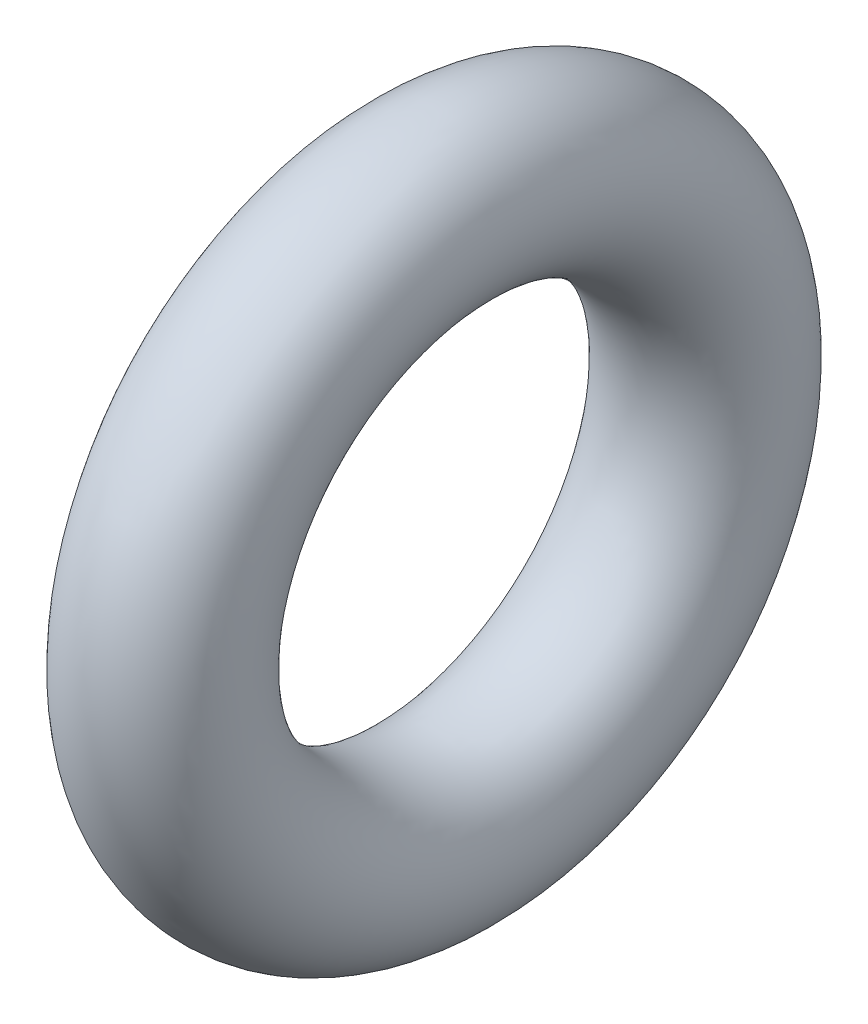
ISO-10303-21;
HEADER;
FILE_DESCRIPTION(('STEP AP214'),'2;1');
FILE_NAME('part.step','',(''),(''),'','','');
FILE_SCHEMA(('AUTOMOTIVE_DESIGN { 1 0 10303 214 1 1 1 1 }'));
ENDSEC;
DATA;
#1=APPLICATION_CONTEXT('core data for automotive mechanical design processes');
#2=APPLICATION_PROTOCOL_DEFINITION('international standard','automotive_design',2000,#1);
#3=PRODUCT_CONTEXT('',#1,'mechanical');
#4=PRODUCT('Part','Part','',(#3));
#5=PRODUCT_RELATED_PRODUCT_CATEGORY('part','',(#4));
#6=PRODUCT_DEFINITION_FORMATION('','',#4);
#7=PRODUCT_DEFINITION_CONTEXT('part definition',#1,'design');
#8=PRODUCT_DEFINITION('design','',#6,#7);
#9=PRODUCT_DEFINITION_SHAPE('','',#8);
#10=(LENGTH_UNIT() NAMED_UNIT(*) SI_UNIT(.MILLI.,.METRE.));
#11=(NAMED_UNIT(*) PLANE_ANGLE_UNIT() SI_UNIT($,.RADIAN.));
#12=(NAMED_UNIT(*) SI_UNIT($,.STERADIAN.) SOLID_ANGLE_UNIT());
#13=UNCERTAINTY_MEASURE_WITH_UNIT(LENGTH_MEASURE(1.E-05),#10,'distance_accuracy_value','');
#14=(GEOMETRIC_REPRESENTATION_CONTEXT(3) GLOBAL_UNCERTAINTY_ASSIGNED_CONTEXT((#13)) GLOBAL_UNIT_ASSIGNED_CONTEXT((#10,
#11,#12)) REPRESENTATION_CONTEXT('',''));
#15=CARTESIAN_POINT('',(0.,0.,0.));
#16=DIRECTION('',(0.,0.,1.));
#17=DIRECTION('',(1.,0.,0.));
#18=AXIS2_PLACEMENT_3D('',#15,#16,#17);
#19=CARTESIAN_POINT('',(5.,0.,0.));
#20=DIRECTION('',(1.,0.,0.));
#21=DIRECTION('',(0.,-1.,0.));
#22=AXIS2_PLACEMENT_3D('',#19,#20,#21);
#23=TOROIDAL_SURFACE('',#22,11.025,3.33333333333333);
#24=CARTESIAN_POINT('',(5.,-14.3583333333333,0.));
#25=VERTEX_POINT('',#24);
#26=VERTEX_LOOP('',#25);
#27=FACE_BOUND('',#26,.T.);
#28=ADVANCED_FACE('F28',(#27),#23,.T.);
#29=CLOSED_SHELL('',(#28));
#30=MANIFOLD_SOLID_BREP('B2',#29);
#31=ADVANCED_BREP_SHAPE_REPRESENTATION('',(#18,#30),#14);
#32=SHAPE_DEFINITION_REPRESENTATION(#9,#31);
ENDSEC;
END-ISO-10303-21;
